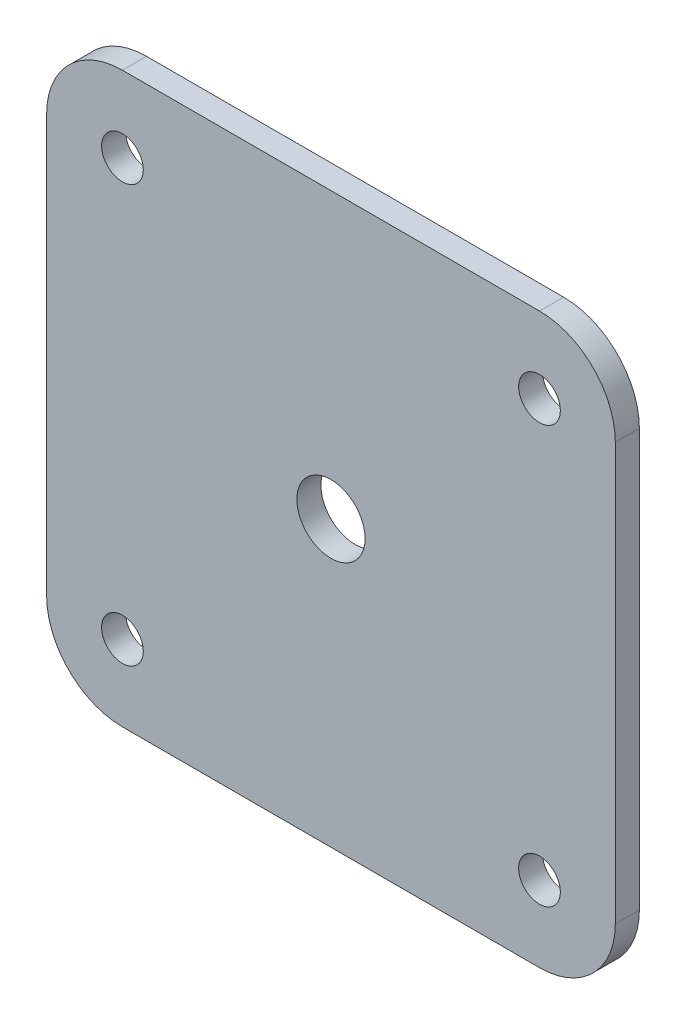
ISO-10303-21;
HEADER;
FILE_DESCRIPTION(('STEP AP214'),'2;1');
FILE_NAME('part.step','',(''),(''),'','','');
FILE_SCHEMA(('AUTOMOTIVE_DESIGN { 1 0 10303 214 1 1 1 1 }'));
ENDSEC;
DATA;
#1=APPLICATION_CONTEXT('core data for automotive mechanical design processes');
#2=APPLICATION_PROTOCOL_DEFINITION('international standard','automotive_design',2000,#1);
#3=PRODUCT_CONTEXT('',#1,'mechanical');
#4=PRODUCT('Part','Part','',(#3));
#5=PRODUCT_RELATED_PRODUCT_CATEGORY('part','',(#4));
#6=PRODUCT_DEFINITION_FORMATION('','',#4);
#7=PRODUCT_DEFINITION_CONTEXT('part definition',#1,'design');
#8=PRODUCT_DEFINITION('design','',#6,#7);
#9=PRODUCT_DEFINITION_SHAPE('','',#8);
#10=(LENGTH_UNIT() NAMED_UNIT(*) SI_UNIT(.MILLI.,.METRE.));
#11=(NAMED_UNIT(*) PLANE_ANGLE_UNIT() SI_UNIT($,.RADIAN.));
#12=(NAMED_UNIT(*) SI_UNIT($,.STERADIAN.) SOLID_ANGLE_UNIT());
#13=UNCERTAINTY_MEASURE_WITH_UNIT(LENGTH_MEASURE(1.E-05),#10,'distance_accuracy_value','');
#14=(GEOMETRIC_REPRESENTATION_CONTEXT(3) GLOBAL_UNCERTAINTY_ASSIGNED_CONTEXT((#13)) GLOBAL_UNIT_ASSIGNED_CONTEXT((#10,
#11,#12)) REPRESENTATION_CONTEXT('',''));
#15=CARTESIAN_POINT('',(0.,0.,0.));
#16=DIRECTION('',(0.,0.,1.));
#17=DIRECTION('',(1.,0.,0.));
#18=AXIS2_PLACEMENT_3D('',#15,#16,#17);
#19=CARTESIAN_POINT('',(37.5,241.9,111.125));
#20=DIRECTION('',(-1.,0.,0.));
#21=DIRECTION('',(0.,0.,1.));
#22=AXIS2_PLACEMENT_3D('',#19,#20,#21);
#23=PLANE('',#22);
#24=DIRECTION('',(0.,1.,0.));
#25=VECTOR('',#24,1.);
#26=CARTESIAN_POINT('',(37.5,241.9,111.125));
#27=LINE('',#26,#25);
#28=CARTESIAN_POINT('',(37.5,251.9,111.125));
#29=VERTEX_POINT('',#28);
#30=CARTESIAN_POINT('',(37.5,306.9,111.125));
#31=VERTEX_POINT('',#30);
#32=EDGE_CURVE('E124',#29,#31,#27,.T.);
#33=ORIENTED_EDGE('',*,*,#32,.F.);
#34=DIRECTION('',(0.,0.,-1.));
#35=VECTOR('',#34,1.);
#36=CARTESIAN_POINT('',(37.5,251.9,111.125));
#37=LINE('',#36,#35);
#38=CARTESIAN_POINT('',(37.5,251.9,107.95));
#39=VERTEX_POINT('',#38);
#40=EDGE_CURVE('E109',#29,#39,#37,.T.);
#41=ORIENTED_EDGE('',*,*,#40,.T.);
#42=DIRECTION('',(0.,1.,0.));
#43=VECTOR('',#42,1.);
#44=CARTESIAN_POINT('',(37.5,241.9,107.95));
#45=LINE('',#44,#43);
#46=CARTESIAN_POINT('',(37.5,306.9,107.95));
#47=VERTEX_POINT('',#46);
#48=EDGE_CURVE('E121',#39,#47,#45,.T.);
#49=ORIENTED_EDGE('',*,*,#48,.T.);
#50=DIRECTION('',(0.,0.,-1.));
#51=VECTOR('',#50,1.);
#52=CARTESIAN_POINT('',(37.5,306.9,111.125));
#53=LINE('',#52,#51);
#54=EDGE_CURVE('E126',#47,#31,#53,.F.);
#55=ORIENTED_EDGE('',*,*,#54,.T.);
#56=EDGE_LOOP('',(#33,#41,#49,#55));
#57=FACE_BOUND('',#56,.T.);
#58=ADVANCED_FACE('F39',(#57),#23,.F.);
#59=CARTESIAN_POINT('',(-37.5,316.9,111.125));
#60=DIRECTION('',(0.,-1.,0.));
#61=DIRECTION('',(0.,0.,-1.));
#62=AXIS2_PLACEMENT_3D('',#59,#60,#61);
#63=PLANE('',#62);
#64=DIRECTION('',(-1.,0.,0.));
#65=VECTOR('',#64,1.);
#66=CARTESIAN_POINT('',(-37.5,316.9,107.95));
#67=LINE('',#66,#65);
#68=CARTESIAN_POINT('',(27.5,316.9,107.95));
#69=VERTEX_POINT('',#68);
#70=CARTESIAN_POINT('',(-27.5,316.9,107.95));
#71=VERTEX_POINT('',#70);
#72=EDGE_CURVE('E130',#69,#71,#67,.T.);
#73=ORIENTED_EDGE('',*,*,#72,.T.);
#74=DIRECTION('',(0.,0.,-1.));
#75=VECTOR('',#74,1.);
#76=CARTESIAN_POINT('',(-27.5,316.9,111.125));
#77=LINE('',#76,#75);
#78=CARTESIAN_POINT('',(-27.5,316.9,111.125));
#79=VERTEX_POINT('',#78);
#80=EDGE_CURVE('E11',#71,#79,#77,.F.);
#81=ORIENTED_EDGE('',*,*,#80,.T.);
#82=DIRECTION('',(-1.,0.,0.));
#83=VECTOR('',#82,1.);
#84=CARTESIAN_POINT('',(-37.5,316.9,111.125));
#85=LINE('',#84,#83);
#86=CARTESIAN_POINT('',(27.5,316.9,111.125));
#87=VERTEX_POINT('',#86);
#88=EDGE_CURVE('E170',#87,#79,#85,.T.);
#89=ORIENTED_EDGE('',*,*,#88,.F.);
#90=DIRECTION('',(0.,0.,-1.));
#91=VECTOR('',#90,1.);
#92=CARTESIAN_POINT('',(27.5,316.9,111.125));
#93=LINE('',#92,#91);
#94=EDGE_CURVE('E47',#87,#69,#93,.T.);
#95=ORIENTED_EDGE('',*,*,#94,.T.);
#96=EDGE_LOOP('',(#73,#81,#89,#95));
#97=FACE_BOUND('',#96,.T.);
#98=ADVANCED_FACE('F168',(#97),#63,.F.);
#99=CARTESIAN_POINT('',(-37.5,241.9,111.125));
#100=DIRECTION('',(1.,0.,0.));
#101=DIRECTION('',(0.,0.,-1.));
#102=AXIS2_PLACEMENT_3D('',#99,#100,#101);
#103=PLANE('',#102);
#104=DIRECTION('',(0.,-1.,0.));
#105=VECTOR('',#104,1.);
#106=CARTESIAN_POINT('',(-37.5,241.9,107.95));
#107=LINE('',#106,#105);
#108=CARTESIAN_POINT('',(-37.5,306.9,107.95));
#109=VERTEX_POINT('',#108);
#110=CARTESIAN_POINT('',(-37.5,251.9,107.95));
#111=VERTEX_POINT('',#110);
#112=EDGE_CURVE('E134',#109,#111,#107,.T.);
#113=ORIENTED_EDGE('',*,*,#112,.T.);
#114=DIRECTION('',(0.,0.,-1.));
#115=VECTOR('',#114,1.);
#116=CARTESIAN_POINT('',(-37.5,251.9,111.125));
#117=LINE('',#116,#115);
#118=CARTESIAN_POINT('',(-37.5,251.9,111.125));
#119=VERTEX_POINT('',#118);
#120=EDGE_CURVE('E54',#111,#119,#117,.F.);
#121=ORIENTED_EDGE('',*,*,#120,.T.);
#122=DIRECTION('',(0.,-1.,0.));
#123=VECTOR('',#122,1.);
#124=CARTESIAN_POINT('',(-37.5,241.9,111.125));
#125=LINE('',#124,#123);
#126=CARTESIAN_POINT('',(-37.5,306.9,111.125));
#127=VERTEX_POINT('',#126);
#128=EDGE_CURVE('E178',#127,#119,#125,.T.);
#129=ORIENTED_EDGE('',*,*,#128,.F.);
#130=DIRECTION('',(0.,0.,-1.));
#131=VECTOR('',#130,1.);
#132=CARTESIAN_POINT('',(-37.5,306.9,111.125));
#133=LINE('',#132,#131);
#134=EDGE_CURVE('E161',#127,#109,#133,.T.);
#135=ORIENTED_EDGE('',*,*,#134,.T.);
#136=EDGE_LOOP('',(#113,#121,#129,#135));
#137=FACE_BOUND('',#136,.T.);
#138=ADVANCED_FACE('F177',(#137),#103,.F.);
#139=CARTESIAN_POINT('',(-37.5,241.9,111.125));
#140=DIRECTION('',(0.,1.,0.));
#141=DIRECTION('',(0.,0.,1.));
#142=AXIS2_PLACEMENT_3D('',#139,#140,#141);
#143=PLANE('',#142);
#144=DIRECTION('',(1.,0.,0.));
#145=VECTOR('',#144,1.);
#146=CARTESIAN_POINT('',(-37.5,241.9,107.95));
#147=LINE('',#146,#145);
#148=CARTESIAN_POINT('',(-27.5,241.9,107.95));
#149=VERTEX_POINT('',#148);
#150=CARTESIAN_POINT('',(27.5,241.9,107.95));
#151=VERTEX_POINT('',#150);
#152=EDGE_CURVE('E144',#149,#151,#147,.T.);
#153=ORIENTED_EDGE('',*,*,#152,.T.);
#154=DIRECTION('',(0.,0.,-1.));
#155=VECTOR('',#154,1.);
#156=CARTESIAN_POINT('',(27.5,241.9,111.125));
#157=LINE('',#156,#155);
#158=CARTESIAN_POINT('',(27.5,241.9,111.125));
#159=VERTEX_POINT('',#158);
#160=EDGE_CURVE('E110',#151,#159,#157,.F.);
#161=ORIENTED_EDGE('',*,*,#160,.T.);
#162=DIRECTION('',(1.,0.,0.));
#163=VECTOR('',#162,1.);
#164=CARTESIAN_POINT('',(-37.5,241.9,111.125));
#165=LINE('',#164,#163);
#166=CARTESIAN_POINT('',(-27.5,241.9,111.125));
#167=VERTEX_POINT('',#166);
#168=EDGE_CURVE('E140',#167,#159,#165,.T.);
#169=ORIENTED_EDGE('',*,*,#168,.F.);
#170=DIRECTION('',(0.,0.,-1.));
#171=VECTOR('',#170,1.);
#172=CARTESIAN_POINT('',(-27.5,241.9,111.125));
#173=LINE('',#172,#171);
#174=EDGE_CURVE('E115',#167,#149,#173,.T.);
#175=ORIENTED_EDGE('',*,*,#174,.T.);
#176=EDGE_LOOP('',(#153,#161,#169,#175));
#177=FACE_BOUND('',#176,.T.);
#178=ADVANCED_FACE('F216',(#177),#143,.F.);
#179=CARTESIAN_POINT('',(0.,0.,111.125));
#180=DIRECTION('',(0.,0.,-1.));
#181=DIRECTION('',(-1.,0.,0.));
#182=AXIS2_PLACEMENT_3D('',#179,#180,#181);
#183=PLANE('',#182);
#184=CARTESIAN_POINT('',(-27.5,306.9,111.125));
#185=DIRECTION('',(0.,0.,1.));
#186=DIRECTION('',(1.,0.,0.));
#187=AXIS2_PLACEMENT_3D('',#184,#185,#186);
#188=CIRCLE('',#187,2.75);
#189=CARTESIAN_POINT('',(-24.75,306.9,111.125));
#190=VERTEX_POINT('',#189);
#191=EDGE_CURVE('E207',#190,#190,#188,.T.);
#192=ORIENTED_EDGE('',*,*,#191,.F.);
#193=EDGE_LOOP('',(#192));
#194=FACE_BOUND('',#193,.T.);
#195=CARTESIAN_POINT('',(27.5,306.9,111.125));
#196=DIRECTION('',(0.,0.,1.));
#197=DIRECTION('',(1.,0.,0.));
#198=AXIS2_PLACEMENT_3D('',#195,#196,#197);
#199=CIRCLE('',#198,2.75);
#200=CARTESIAN_POINT('',(30.25,306.9,111.125));
#201=VERTEX_POINT('',#200);
#202=EDGE_CURVE('E201',#201,#201,#199,.T.);
#203=ORIENTED_EDGE('',*,*,#202,.F.);
#204=EDGE_LOOP('',(#203));
#205=FACE_BOUND('',#204,.T.);
#206=CARTESIAN_POINT('',(27.5,251.9,111.125));
#207=DIRECTION('',(0.,0.,1.));
#208=DIRECTION('',(1.,0.,0.));
#209=AXIS2_PLACEMENT_3D('',#206,#207,#208);
#210=CIRCLE('',#209,2.75);
#211=CARTESIAN_POINT('',(30.25,251.9,111.125));
#212=VERTEX_POINT('',#211);
#213=EDGE_CURVE('E195',#212,#212,#210,.T.);
#214=ORIENTED_EDGE('',*,*,#213,.F.);
#215=EDGE_LOOP('',(#214));
#216=FACE_BOUND('',#215,.T.);
#217=CARTESIAN_POINT('',(-27.5,251.9,111.125));
#218=DIRECTION('',(0.,0.,1.));
#219=DIRECTION('',(1.,0.,0.));
#220=AXIS2_PLACEMENT_3D('',#217,#218,#219);
#221=CIRCLE('',#220,2.75);
#222=CARTESIAN_POINT('',(-24.75,251.9,111.125));
#223=VERTEX_POINT('',#222);
#224=EDGE_CURVE('E189',#223,#223,#221,.T.);
#225=ORIENTED_EDGE('',*,*,#224,.F.);
#226=EDGE_LOOP('',(#225));
#227=FACE_BOUND('',#226,.T.);
#228=CARTESIAN_POINT('',(0.,279.4,111.125));
#229=DIRECTION('',(0.,0.,1.));
#230=DIRECTION('',(1.,0.,0.));
#231=AXIS2_PLACEMENT_3D('',#228,#229,#230);
#232=CIRCLE('',#231,4.5);
#233=CARTESIAN_POINT('',(4.5,279.4,111.125));
#234=VERTEX_POINT('',#233);
#235=EDGE_CURVE('E137',#234,#234,#232,.T.);
#236=ORIENTED_EDGE('',*,*,#235,.F.);
#237=EDGE_LOOP('',(#236));
#238=FACE_BOUND('',#237,.T.);
#239=ORIENTED_EDGE('',*,*,#168,.T.);
#240=CARTESIAN_POINT('',(27.5,251.9,111.125));
#241=DIRECTION('',(0.,0.,-1.));
#242=DIRECTION('',(-1.,0.,0.));
#243=AXIS2_PLACEMENT_3D('',#240,#241,#242);
#244=CIRCLE('',#243,10.);
#245=EDGE_CURVE('E159',#159,#29,#244,.F.);
#246=ORIENTED_EDGE('',*,*,#245,.T.);
#247=ORIENTED_EDGE('',*,*,#32,.T.);
#248=CARTESIAN_POINT('',(27.5,306.9,111.125));
#249=DIRECTION('',(0.,0.,-1.));
#250=DIRECTION('',(-1.,0.,0.));
#251=AXIS2_PLACEMENT_3D('',#248,#249,#250);
#252=CIRCLE('',#251,10.);
#253=EDGE_CURVE('E154',#31,#87,#252,.F.);
#254=ORIENTED_EDGE('',*,*,#253,.T.);
#255=ORIENTED_EDGE('',*,*,#88,.T.);
#256=CARTESIAN_POINT('',(-27.5,306.9,111.125));
#257=DIRECTION('',(0.,0.,-1.));
#258=DIRECTION('',(-1.,0.,0.));
#259=AXIS2_PLACEMENT_3D('',#256,#257,#258);
#260=CIRCLE('',#259,10.);
#261=EDGE_CURVE('E61',#79,#127,#260,.F.);
#262=ORIENTED_EDGE('',*,*,#261,.T.);
#263=ORIENTED_EDGE('',*,*,#128,.T.);
#264=CARTESIAN_POINT('',(-27.5,251.9,111.125));
#265=DIRECTION('',(0.,0.,-1.));
#266=DIRECTION('',(-1.,0.,0.));
#267=AXIS2_PLACEMENT_3D('',#264,#265,#266);
#268=CIRCLE('',#267,10.);
#269=EDGE_CURVE('E157',#119,#167,#268,.F.);
#270=ORIENTED_EDGE('',*,*,#269,.T.);
#271=EDGE_LOOP('',(#239,#246,#247,#254,#255,#262,#263,#270));
#272=FACE_BOUND('',#271,.T.);
#273=ADVANCED_FACE('F213',(#194,#205,#216,#227,#238,#272),#183,.F.);
#274=CARTESIAN_POINT('',(0.,0.,107.95));
#275=DIRECTION('',(0.,0.,-1.));
#276=DIRECTION('',(-1.,0.,0.));
#277=AXIS2_PLACEMENT_3D('',#274,#275,#276);
#278=PLANE('',#277);
#279=CARTESIAN_POINT('',(-27.5,306.9,107.95));
#280=DIRECTION('',(0.,0.,1.));
#281=DIRECTION('',(1.,0.,0.));
#282=AXIS2_PLACEMENT_3D('',#279,#280,#281);
#283=CIRCLE('',#282,2.75);
#284=CARTESIAN_POINT('',(-24.75,306.9,107.95));
#285=VERTEX_POINT('',#284);
#286=EDGE_CURVE('E204',#285,#285,#283,.T.);
#287=ORIENTED_EDGE('',*,*,#286,.T.);
#288=EDGE_LOOP('',(#287));
#289=FACE_BOUND('',#288,.T.);
#290=CARTESIAN_POINT('',(27.5,306.9,107.95));
#291=DIRECTION('',(0.,0.,1.));
#292=DIRECTION('',(1.,0.,0.));
#293=AXIS2_PLACEMENT_3D('',#290,#291,#292);
#294=CIRCLE('',#293,2.75);
#295=CARTESIAN_POINT('',(30.25,306.9,107.95));
#296=VERTEX_POINT('',#295);
#297=EDGE_CURVE('E198',#296,#296,#294,.T.);
#298=ORIENTED_EDGE('',*,*,#297,.T.);
#299=EDGE_LOOP('',(#298));
#300=FACE_BOUND('',#299,.T.);
#301=CARTESIAN_POINT('',(27.5,251.9,107.95));
#302=DIRECTION('',(0.,0.,1.));
#303=DIRECTION('',(1.,0.,0.));
#304=AXIS2_PLACEMENT_3D('',#301,#302,#303);
#305=CIRCLE('',#304,2.75);
#306=CARTESIAN_POINT('',(30.25,251.9,107.95));
#307=VERTEX_POINT('',#306);
#308=EDGE_CURVE('E192',#307,#307,#305,.T.);
#309=ORIENTED_EDGE('',*,*,#308,.T.);
#310=EDGE_LOOP('',(#309));
#311=FACE_BOUND('',#310,.T.);
#312=CARTESIAN_POINT('',(-27.5,251.9,107.95));
#313=DIRECTION('',(0.,0.,1.));
#314=DIRECTION('',(1.,0.,0.));
#315=AXIS2_PLACEMENT_3D('',#312,#313,#314);
#316=CIRCLE('',#315,2.75);
#317=CARTESIAN_POINT('',(-24.75,251.9,107.95));
#318=VERTEX_POINT('',#317);
#319=EDGE_CURVE('E186',#318,#318,#316,.T.);
#320=ORIENTED_EDGE('',*,*,#319,.T.);
#321=EDGE_LOOP('',(#320));
#322=FACE_BOUND('',#321,.T.);
#323=CARTESIAN_POINT('',(0.,279.4,107.95));
#324=DIRECTION('',(0.,0.,1.));
#325=DIRECTION('',(1.,0.,0.));
#326=AXIS2_PLACEMENT_3D('',#323,#324,#325);
#327=CIRCLE('',#326,4.5);
#328=CARTESIAN_POINT('',(4.5,279.4,107.95));
#329=VERTEX_POINT('',#328);
#330=EDGE_CURVE('E131',#329,#329,#327,.T.);
#331=ORIENTED_EDGE('',*,*,#330,.T.);
#332=EDGE_LOOP('',(#331));
#333=FACE_BOUND('',#332,.T.);
#334=ORIENTED_EDGE('',*,*,#48,.F.);
#335=CARTESIAN_POINT('',(27.5,251.9,107.95));
#336=DIRECTION('',(0.,0.,-1.));
#337=DIRECTION('',(-1.,0.,0.));
#338=AXIS2_PLACEMENT_3D('',#335,#336,#337);
#339=CIRCLE('',#338,10.);
#340=EDGE_CURVE('E105',#39,#151,#339,.T.);
#341=ORIENTED_EDGE('',*,*,#340,.T.);
#342=ORIENTED_EDGE('',*,*,#152,.F.);
#343=CARTESIAN_POINT('',(-27.5,251.9,107.95));
#344=DIRECTION('',(0.,0.,-1.));
#345=DIRECTION('',(-1.,0.,0.));
#346=AXIS2_PLACEMENT_3D('',#343,#344,#345);
#347=CIRCLE('',#346,10.);
#348=EDGE_CURVE('E116',#149,#111,#347,.T.);
#349=ORIENTED_EDGE('',*,*,#348,.T.);
#350=ORIENTED_EDGE('',*,*,#112,.F.);
#351=CARTESIAN_POINT('',(-27.5,306.9,107.95));
#352=DIRECTION('',(0.,0.,-1.));
#353=DIRECTION('',(-1.,0.,0.));
#354=AXIS2_PLACEMENT_3D('',#351,#352,#353);
#355=CIRCLE('',#354,10.);
#356=EDGE_CURVE('E148',#109,#71,#355,.T.);
#357=ORIENTED_EDGE('',*,*,#356,.T.);
#358=ORIENTED_EDGE('',*,*,#72,.F.);
#359=CARTESIAN_POINT('',(27.5,306.9,107.95));
#360=DIRECTION('',(0.,0.,-1.));
#361=DIRECTION('',(-1.,0.,0.));
#362=AXIS2_PLACEMENT_3D('',#359,#360,#361);
#363=CIRCLE('',#362,10.);
#364=EDGE_CURVE('E125',#69,#47,#363,.T.);
#365=ORIENTED_EDGE('',*,*,#364,.T.);
#366=EDGE_LOOP('',(#334,#341,#342,#349,#350,#357,#358,#365));
#367=FACE_BOUND('',#366,.T.);
#368=ADVANCED_FACE('F128',(#289,#300,#311,#322,#333,#367),#278,.T.);
#369=CARTESIAN_POINT('',(0.,279.4,111.125));
#370=DIRECTION('',(0.,0.,1.));
#371=DIRECTION('',(1.,0.,0.));
#372=AXIS2_PLACEMENT_3D('',#369,#370,#371);
#373=CYLINDRICAL_SURFACE('',#372,4.5);
#374=ORIENTED_EDGE('',*,*,#330,.F.);
#375=EDGE_LOOP('',(#374));
#376=FACE_BOUND('',#375,.T.);
#377=ORIENTED_EDGE('',*,*,#235,.T.);
#378=EDGE_LOOP('',(#377));
#379=FACE_BOUND('',#378,.T.);
#380=ADVANCED_FACE('F250',(#376,#379),#373,.F.);
#381=CARTESIAN_POINT('',(-27.5,251.9,111.125));
#382=DIRECTION('',(0.,0.,1.));
#383=DIRECTION('',(1.,0.,0.));
#384=AXIS2_PLACEMENT_3D('',#381,#382,#383);
#385=CYLINDRICAL_SURFACE('',#384,2.75);
#386=ORIENTED_EDGE('',*,*,#319,.F.);
#387=EDGE_LOOP('',(#386));
#388=FACE_BOUND('',#387,.T.);
#389=ORIENTED_EDGE('',*,*,#224,.T.);
#390=EDGE_LOOP('',(#389));
#391=FACE_BOUND('',#390,.T.);
#392=ADVANCED_FACE('F255',(#388,#391),#385,.F.);
#393=CARTESIAN_POINT('',(27.5,251.9,111.125));
#394=DIRECTION('',(0.,0.,1.));
#395=DIRECTION('',(1.,0.,0.));
#396=AXIS2_PLACEMENT_3D('',#393,#394,#395);
#397=CYLINDRICAL_SURFACE('',#396,2.75);
#398=ORIENTED_EDGE('',*,*,#308,.F.);
#399=EDGE_LOOP('',(#398));
#400=FACE_BOUND('',#399,.T.);
#401=ORIENTED_EDGE('',*,*,#213,.T.);
#402=EDGE_LOOP('',(#401));
#403=FACE_BOUND('',#402,.T.);
#404=ADVANCED_FACE('F259',(#400,#403),#397,.F.);
#405=CARTESIAN_POINT('',(27.5,306.9,111.125));
#406=DIRECTION('',(0.,0.,1.));
#407=DIRECTION('',(1.,0.,0.));
#408=AXIS2_PLACEMENT_3D('',#405,#406,#407);
#409=CYLINDRICAL_SURFACE('',#408,2.75);
#410=ORIENTED_EDGE('',*,*,#297,.F.);
#411=EDGE_LOOP('',(#410));
#412=FACE_BOUND('',#411,.T.);
#413=ORIENTED_EDGE('',*,*,#202,.T.);
#414=EDGE_LOOP('',(#413));
#415=FACE_BOUND('',#414,.T.);
#416=ADVANCED_FACE('F263',(#412,#415),#409,.F.);
#417=CARTESIAN_POINT('',(-27.5,306.9,111.125));
#418=DIRECTION('',(0.,0.,1.));
#419=DIRECTION('',(1.,0.,0.));
#420=AXIS2_PLACEMENT_3D('',#417,#418,#419);
#421=CYLINDRICAL_SURFACE('',#420,2.75);
#422=ORIENTED_EDGE('',*,*,#286,.F.);
#423=EDGE_LOOP('',(#422));
#424=FACE_BOUND('',#423,.T.);
#425=ORIENTED_EDGE('',*,*,#191,.T.);
#426=EDGE_LOOP('',(#425));
#427=FACE_BOUND('',#426,.T.);
#428=ADVANCED_FACE('F211',(#424,#427),#421,.F.);
#429=CARTESIAN_POINT('',(27.5,251.9,111.125));
#430=DIRECTION('',(0.,0.,-1.));
#431=DIRECTION('',(-1.,0.,0.));
#432=AXIS2_PLACEMENT_3D('',#429,#430,#431);
#433=CYLINDRICAL_SURFACE('',#432,10.);
#434=ORIENTED_EDGE('',*,*,#245,.F.);
#435=ORIENTED_EDGE('',*,*,#160,.F.);
#436=ORIENTED_EDGE('',*,*,#340,.F.);
#437=ORIENTED_EDGE('',*,*,#40,.F.);
#438=EDGE_LOOP('',(#434,#435,#436,#437));
#439=FACE_BOUND('',#438,.T.);
#440=ADVANCED_FACE('F108',(#439),#433,.T.);
#441=CARTESIAN_POINT('',(-27.5,251.9,111.125));
#442=DIRECTION('',(0.,0.,-1.));
#443=DIRECTION('',(-1.,0.,0.));
#444=AXIS2_PLACEMENT_3D('',#441,#442,#443);
#445=CYLINDRICAL_SURFACE('',#444,10.);
#446=ORIENTED_EDGE('',*,*,#269,.F.);
#447=ORIENTED_EDGE('',*,*,#120,.F.);
#448=ORIENTED_EDGE('',*,*,#348,.F.);
#449=ORIENTED_EDGE('',*,*,#174,.F.);
#450=EDGE_LOOP('',(#446,#447,#448,#449));
#451=FACE_BOUND('',#450,.T.);
#452=ADVANCED_FACE('F229',(#451),#445,.T.);
#453=CARTESIAN_POINT('',(-27.5,306.9,111.125));
#454=DIRECTION('',(0.,0.,-1.));
#455=DIRECTION('',(-1.,0.,0.));
#456=AXIS2_PLACEMENT_3D('',#453,#454,#455);
#457=CYLINDRICAL_SURFACE('',#456,10.);
#458=ORIENTED_EDGE('',*,*,#261,.F.);
#459=ORIENTED_EDGE('',*,*,#80,.F.);
#460=ORIENTED_EDGE('',*,*,#356,.F.);
#461=ORIENTED_EDGE('',*,*,#134,.F.);
#462=EDGE_LOOP('',(#458,#459,#460,#461));
#463=FACE_BOUND('',#462,.T.);
#464=ADVANCED_FACE('F176',(#463),#457,.T.);
#465=CARTESIAN_POINT('',(27.5,306.9,111.125));
#466=DIRECTION('',(0.,0.,-1.));
#467=DIRECTION('',(-1.,0.,0.));
#468=AXIS2_PLACEMENT_3D('',#465,#466,#467);
#469=CYLINDRICAL_SURFACE('',#468,10.);
#470=ORIENTED_EDGE('',*,*,#253,.F.);
#471=ORIENTED_EDGE('',*,*,#54,.F.);
#472=ORIENTED_EDGE('',*,*,#364,.F.);
#473=ORIENTED_EDGE('',*,*,#94,.F.);
#474=EDGE_LOOP('',(#470,#471,#472,#473));
#475=FACE_BOUND('',#474,.T.);
#476=ADVANCED_FACE('F41',(#475),#469,.T.);
#477=CLOSED_SHELL('',(#58,#98,#138,#178,#273,#368,#380,#392,#404,#416,#428,#440,#452,#464,#476));
#478=MANIFOLD_SOLID_BREP('B2',#477);
#479=ADVANCED_BREP_SHAPE_REPRESENTATION('',(#18,#478),#14);
#480=SHAPE_DEFINITION_REPRESENTATION(#9,#479);
ENDSEC;
END-ISO-10303-21;
